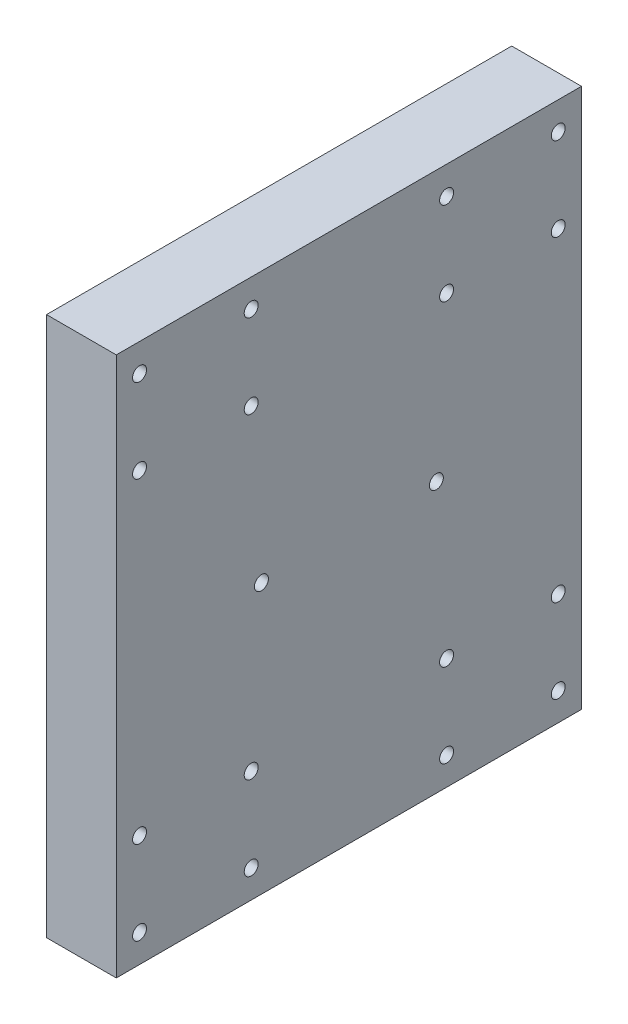
ISO-10303-21;
HEADER;
FILE_DESCRIPTION(('STEP AP214'),'2;1');
FILE_NAME('part.step','',(''),(''),'','','');
FILE_SCHEMA(('AUTOMOTIVE_DESIGN { 1 0 10303 214 1 1 1 1 }'));
ENDSEC;
DATA;
#1=APPLICATION_CONTEXT('core data for automotive mechanical design processes');
#2=APPLICATION_PROTOCOL_DEFINITION('international standard','automotive_design',2000,#1);
#3=PRODUCT_CONTEXT('',#1,'mechanical');
#4=PRODUCT('Part','Part','',(#3));
#5=PRODUCT_RELATED_PRODUCT_CATEGORY('part','',(#4));
#6=PRODUCT_DEFINITION_FORMATION('','',#4);
#7=PRODUCT_DEFINITION_CONTEXT('part definition',#1,'design');
#8=PRODUCT_DEFINITION('design','',#6,#7);
#9=PRODUCT_DEFINITION_SHAPE('','',#8);
#10=(LENGTH_UNIT() NAMED_UNIT(*) SI_UNIT(.MILLI.,.METRE.));
#11=(NAMED_UNIT(*) PLANE_ANGLE_UNIT() SI_UNIT($,.RADIAN.));
#12=(NAMED_UNIT(*) SI_UNIT($,.STERADIAN.) SOLID_ANGLE_UNIT());
#13=UNCERTAINTY_MEASURE_WITH_UNIT(LENGTH_MEASURE(1.E-05),#10,'distance_accuracy_value','');
#14=(GEOMETRIC_REPRESENTATION_CONTEXT(3) GLOBAL_UNCERTAINTY_ASSIGNED_CONTEXT((#13)) GLOBAL_UNIT_ASSIGNED_CONTEXT((#10,
#11,#12)) REPRESENTATION_CONTEXT('',''));
#15=CARTESIAN_POINT('',(0.,0.,0.));
#16=DIRECTION('',(0.,0.,1.));
#17=DIRECTION('',(1.,0.,0.));
#18=AXIS2_PLACEMENT_3D('',#15,#16,#17);
#19=CARTESIAN_POINT('',(15.,0.,0.));
#20=DIRECTION('',(-1.,0.,0.));
#21=DIRECTION('',(0.,0.,1.));
#22=AXIS2_PLACEMENT_3D('',#19,#20,#21);
#23=PLANE('',#22);
#24=CARTESIAN_POINT('',(15.,110.,-71.));
#25=DIRECTION('',(1.,0.,0.));
#26=DIRECTION('',(0.,0.,1.));
#27=AXIS2_PLACEMENT_3D('',#24,#25,#26);
#28=CIRCLE('',#27,1.5);
#29=CARTESIAN_POINT('',(15.,110.,-69.5));
#30=VERTEX_POINT('',#29);
#31=EDGE_CURVE('E205',#30,#30,#28,.T.);
#32=ORIENTED_EDGE('',*,*,#31,.F.);
#33=EDGE_LOOP('',(#32));
#34=FACE_BOUND('',#33,.T.);
#35=CARTESIAN_POINT('',(15.,92.,-95.));
#36=DIRECTION('',(1.,0.,0.));
#37=DIRECTION('',(0.,0.,1.));
#38=AXIS2_PLACEMENT_3D('',#35,#36,#37);
#39=CIRCLE('',#38,1.5);
#40=CARTESIAN_POINT('',(15.,92.,-93.5));
#41=VERTEX_POINT('',#40);
#42=EDGE_CURVE('E193',#41,#41,#39,.T.);
#43=ORIENTED_EDGE('',*,*,#42,.F.);
#44=EDGE_LOOP('',(#43));
#45=FACE_BOUND('',#44,.T.);
#46=CARTESIAN_POINT('',(15.,24.,-95.));
#47=DIRECTION('',(1.,0.,0.));
#48=DIRECTION('',(0.,0.,-1.));
#49=AXIS2_PLACEMENT_3D('',#46,#47,#48);
#50=CIRCLE('',#49,1.5);
#51=CARTESIAN_POINT('',(15.,24.,-96.5));
#52=VERTEX_POINT('',#51);
#53=EDGE_CURVE('E181',#52,#52,#50,.T.);
#54=ORIENTED_EDGE('',*,*,#53,.F.);
#55=EDGE_LOOP('',(#54));
#56=FACE_BOUND('',#55,.T.);
#57=CARTESIAN_POINT('',(15.,6.00000000000002,-71.));
#58=DIRECTION('',(1.,0.,0.));
#59=DIRECTION('',(0.,0.,-1.));
#60=AXIS2_PLACEMENT_3D('',#57,#58,#59);
#61=CIRCLE('',#60,1.5);
#62=CARTESIAN_POINT('',(15.,6.00000000000002,-72.5));
#63=VERTEX_POINT('',#62);
#64=EDGE_CURVE('E169',#63,#63,#61,.T.);
#65=ORIENTED_EDGE('',*,*,#64,.F.);
#66=EDGE_LOOP('',(#65));
#67=FACE_BOUND('',#66,.T.);
#68=CARTESIAN_POINT('',(15.,58.,-31.2));
#69=DIRECTION('',(1.,0.,0.));
#70=DIRECTION('',(0.,0.,-1.));
#71=AXIS2_PLACEMENT_3D('',#68,#69,#70);
#72=CIRCLE('',#71,1.5);
#73=CARTESIAN_POINT('',(15.,58.,-32.7));
#74=VERTEX_POINT('',#73);
#75=EDGE_CURVE('E157',#74,#74,#72,.T.);
#76=ORIENTED_EDGE('',*,*,#75,.F.);
#77=EDGE_LOOP('',(#76));
#78=FACE_BOUND('',#77,.T.);
#79=CARTESIAN_POINT('',(15.,6.00000000000001,-29.));
#80=DIRECTION('',(1.,0.,0.));
#81=DIRECTION('',(0.,0.,1.));
#82=AXIS2_PLACEMENT_3D('',#79,#80,#81);
#83=CIRCLE('',#82,1.5);
#84=CARTESIAN_POINT('',(15.,6.00000000000001,-27.5));
#85=VERTEX_POINT('',#84);
#86=EDGE_CURVE('E145',#85,#85,#83,.T.);
#87=ORIENTED_EDGE('',*,*,#86,.F.);
#88=EDGE_LOOP('',(#87));
#89=FACE_BOUND('',#88,.T.);
#90=CARTESIAN_POINT('',(15.,24.,-5.));
#91=DIRECTION('',(1.,0.,0.));
#92=DIRECTION('',(0.,0.,1.));
#93=AXIS2_PLACEMENT_3D('',#90,#91,#92);
#94=CIRCLE('',#93,1.5);
#95=CARTESIAN_POINT('',(15.,24.,-3.5));
#96=VERTEX_POINT('',#95);
#97=EDGE_CURVE('E133',#96,#96,#94,.T.);
#98=ORIENTED_EDGE('',*,*,#97,.F.);
#99=EDGE_LOOP('',(#98));
#100=FACE_BOUND('',#99,.T.);
#101=CARTESIAN_POINT('',(15.,92.,-5.));
#102=DIRECTION('',(1.,0.,0.));
#103=DIRECTION('',(0.,0.,-1.));
#104=AXIS2_PLACEMENT_3D('',#101,#102,#103);
#105=CIRCLE('',#104,1.5);
#106=CARTESIAN_POINT('',(15.,92.,-6.5));
#107=VERTEX_POINT('',#106);
#108=EDGE_CURVE('E121',#107,#107,#105,.T.);
#109=ORIENTED_EDGE('',*,*,#108,.F.);
#110=EDGE_LOOP('',(#109));
#111=FACE_BOUND('',#110,.T.);
#112=CARTESIAN_POINT('',(15.,110.,-5.));
#113=DIRECTION('',(1.,0.,0.));
#114=DIRECTION('',(0.,0.,-1.));
#115=AXIS2_PLACEMENT_3D('',#112,#113,#114);
#116=CIRCLE('',#115,1.5);
#117=CARTESIAN_POINT('',(15.,110.,-6.5));
#118=VERTEX_POINT('',#117);
#119=EDGE_CURVE('E100',#118,#118,#116,.T.);
#120=ORIENTED_EDGE('',*,*,#119,.F.);
#121=EDGE_LOOP('',(#120));
#122=FACE_BOUND('',#121,.T.);
#123=DIRECTION('',(0.,-1.,0.));
#124=VECTOR('',#123,1.);
#125=CARTESIAN_POINT('',(15.,0.,0.));
#126=LINE('',#125,#124);
#127=CARTESIAN_POINT('',(15.,116.,0.));
#128=VERTEX_POINT('',#127);
#129=CARTESIAN_POINT('',(15.,0.,0.));
#130=VERTEX_POINT('',#129);
#131=EDGE_CURVE('E85',#128,#130,#126,.T.);
#132=ORIENTED_EDGE('',*,*,#131,.T.);
#133=DIRECTION('',(0.,0.,-1.));
#134=VECTOR('',#133,1.);
#135=CARTESIAN_POINT('',(15.,0.,0.));
#136=LINE('',#135,#134);
#137=CARTESIAN_POINT('',(15.,0.,-100.));
#138=VERTEX_POINT('',#137);
#139=EDGE_CURVE('E80',#130,#138,#136,.T.);
#140=ORIENTED_EDGE('',*,*,#139,.T.);
#141=DIRECTION('',(0.,1.,0.));
#142=VECTOR('',#141,1.);
#143=CARTESIAN_POINT('',(15.,0.,-100.));
#144=LINE('',#143,#142);
#145=CARTESIAN_POINT('',(15.,116.,-100.));
#146=VERTEX_POINT('',#145);
#147=EDGE_CURVE('E83',#138,#146,#144,.T.);
#148=ORIENTED_EDGE('',*,*,#147,.T.);
#149=DIRECTION('',(0.,0.,1.));
#150=VECTOR('',#149,1.);
#151=CARTESIAN_POINT('',(15.,116.,0.));
#152=LINE('',#151,#150);
#153=EDGE_CURVE('E50',#146,#128,#152,.T.);
#154=ORIENTED_EDGE('',*,*,#153,.T.);
#155=EDGE_LOOP('',(#132,#140,#148,#154));
#156=FACE_BOUND('',#155,.T.);
#157=CARTESIAN_POINT('',(15.,110.,-29.));
#158=DIRECTION('',(1.,0.,0.));
#159=DIRECTION('',(0.,0.,-1.));
#160=AXIS2_PLACEMENT_3D('',#157,#158,#159);
#161=CIRCLE('',#160,1.5);
#162=CARTESIAN_POINT('',(15.,110.,-30.5));
#163=VERTEX_POINT('',#162);
#164=EDGE_CURVE('E115',#163,#163,#161,.T.);
#165=ORIENTED_EDGE('',*,*,#164,.F.);
#166=EDGE_LOOP('',(#165));
#167=FACE_BOUND('',#166,.T.);
#168=CARTESIAN_POINT('',(15.,92.,-29.));
#169=DIRECTION('',(1.,0.,0.));
#170=DIRECTION('',(0.,0.,-1.));
#171=AXIS2_PLACEMENT_3D('',#168,#169,#170);
#172=CIRCLE('',#171,1.5);
#173=CARTESIAN_POINT('',(15.,92.,-30.5));
#174=VERTEX_POINT('',#173);
#175=EDGE_CURVE('E127',#174,#174,#172,.T.);
#176=ORIENTED_EDGE('',*,*,#175,.F.);
#177=EDGE_LOOP('',(#176));
#178=FACE_BOUND('',#177,.T.);
#179=CARTESIAN_POINT('',(15.,24.,-29.));
#180=DIRECTION('',(1.,0.,0.));
#181=DIRECTION('',(0.,0.,1.));
#182=AXIS2_PLACEMENT_3D('',#179,#180,#181);
#183=CIRCLE('',#182,1.5);
#184=CARTESIAN_POINT('',(15.,24.,-27.5));
#185=VERTEX_POINT('',#184);
#186=EDGE_CURVE('E139',#185,#185,#183,.T.);
#187=ORIENTED_EDGE('',*,*,#186,.F.);
#188=EDGE_LOOP('',(#187));
#189=FACE_BOUND('',#188,.T.);
#190=CARTESIAN_POINT('',(15.,6.00000000000001,-5.));
#191=DIRECTION('',(1.,0.,0.));
#192=DIRECTION('',(0.,0.,1.));
#193=AXIS2_PLACEMENT_3D('',#190,#191,#192);
#194=CIRCLE('',#193,1.5);
#195=CARTESIAN_POINT('',(15.,6.00000000000001,-3.5));
#196=VERTEX_POINT('',#195);
#197=EDGE_CURVE('E151',#196,#196,#194,.T.);
#198=ORIENTED_EDGE('',*,*,#197,.F.);
#199=EDGE_LOOP('',(#198));
#200=FACE_BOUND('',#199,.T.);
#201=CARTESIAN_POINT('',(15.,58.,-68.8));
#202=DIRECTION('',(1.,0.,0.));
#203=DIRECTION('',(0.,0.,-1.));
#204=AXIS2_PLACEMENT_3D('',#201,#202,#203);
#205=CIRCLE('',#204,1.5);
#206=CARTESIAN_POINT('',(15.,58.,-70.3));
#207=VERTEX_POINT('',#206);
#208=EDGE_CURVE('E163',#207,#207,#205,.T.);
#209=ORIENTED_EDGE('',*,*,#208,.F.);
#210=EDGE_LOOP('',(#209));
#211=FACE_BOUND('',#210,.T.);
#212=CARTESIAN_POINT('',(15.,6.00000000000001,-95.));
#213=DIRECTION('',(1.,0.,0.));
#214=DIRECTION('',(0.,0.,-1.));
#215=AXIS2_PLACEMENT_3D('',#212,#213,#214);
#216=CIRCLE('',#215,1.5);
#217=CARTESIAN_POINT('',(15.,6.00000000000001,-96.5));
#218=VERTEX_POINT('',#217);
#219=EDGE_CURVE('E175',#218,#218,#216,.T.);
#220=ORIENTED_EDGE('',*,*,#219,.F.);
#221=EDGE_LOOP('',(#220));
#222=FACE_BOUND('',#221,.T.);
#223=CARTESIAN_POINT('',(15.,24.,-71.));
#224=DIRECTION('',(1.,0.,0.));
#225=DIRECTION('',(0.,0.,-1.));
#226=AXIS2_PLACEMENT_3D('',#223,#224,#225);
#227=CIRCLE('',#226,1.5);
#228=CARTESIAN_POINT('',(15.,24.,-72.5));
#229=VERTEX_POINT('',#228);
#230=EDGE_CURVE('E187',#229,#229,#227,.T.);
#231=ORIENTED_EDGE('',*,*,#230,.F.);
#232=EDGE_LOOP('',(#231));
#233=FACE_BOUND('',#232,.T.);
#234=CARTESIAN_POINT('',(15.,92.,-71.));
#235=DIRECTION('',(1.,0.,0.));
#236=DIRECTION('',(0.,0.,1.));
#237=AXIS2_PLACEMENT_3D('',#234,#235,#236);
#238=CIRCLE('',#237,1.5);
#239=CARTESIAN_POINT('',(15.,92.,-69.5));
#240=VERTEX_POINT('',#239);
#241=EDGE_CURVE('E199',#240,#240,#238,.T.);
#242=ORIENTED_EDGE('',*,*,#241,.F.);
#243=EDGE_LOOP('',(#242));
#244=FACE_BOUND('',#243,.T.);
#245=CARTESIAN_POINT('',(15.,110.,-95.));
#246=DIRECTION('',(1.,0.,0.));
#247=DIRECTION('',(0.,0.,1.));
#248=AXIS2_PLACEMENT_3D('',#245,#246,#247);
#249=CIRCLE('',#248,1.5);
#250=CARTESIAN_POINT('',(15.,110.,-93.5));
#251=VERTEX_POINT('',#250);
#252=EDGE_CURVE('E211',#251,#251,#249,.T.);
#253=ORIENTED_EDGE('',*,*,#252,.F.);
#254=EDGE_LOOP('',(#253));
#255=FACE_BOUND('',#254,.T.);
#256=ADVANCED_FACE('F33',(#34,#45,#56,#67,#78,#89,#100,#111,#122,#156,#167,#178,#189,#200,#211,
#222,#233,#244,#255),#23,.F.);
#257=CARTESIAN_POINT('',(0.,0.,0.));
#258=DIRECTION('',(-1.,0.,0.));
#259=DIRECTION('',(0.,0.,1.));
#260=AXIS2_PLACEMENT_3D('',#257,#258,#259);
#261=PLANE('',#260);
#262=CARTESIAN_POINT('',(0.,58.,-54.5));
#263=DIRECTION('',(-1.,0.,0.));
#264=DIRECTION('',(0.,0.,1.));
#265=AXIS2_PLACEMENT_3D('',#262,#263,#264);
#266=CIRCLE('',#265,11.);
#267=CARTESIAN_POINT('',(0.,58.,-43.5));
#268=VERTEX_POINT('',#267);
#269=EDGE_CURVE('E232',#268,#268,#266,.T.);
#270=ORIENTED_EDGE('',*,*,#269,.F.);
#271=EDGE_LOOP('',(#270));
#272=FACE_BOUND('',#271,.T.);
#273=CARTESIAN_POINT('',(0.,17.,-53.5));
#274=DIRECTION('',(-1.,0.,0.));
#275=DIRECTION('',(0.,0.,1.));
#276=AXIS2_PLACEMENT_3D('',#273,#274,#275);
#277=CIRCLE('',#276,5.);
#278=CARTESIAN_POINT('',(0.,17.,-48.5));
#279=VERTEX_POINT('',#278);
#280=EDGE_CURVE('E226',#279,#279,#277,.T.);
#281=ORIENTED_EDGE('',*,*,#280,.F.);
#282=EDGE_LOOP('',(#281));
#283=FACE_BOUND('',#282,.T.);
#284=CARTESIAN_POINT('',(0.,99.,-53.5));
#285=DIRECTION('',(-1.,0.,0.));
#286=DIRECTION('',(0.,0.,1.));
#287=AXIS2_PLACEMENT_3D('',#284,#285,#286);
#288=CIRCLE('',#287,5.);
#289=CARTESIAN_POINT('',(0.,99.,-48.5));
#290=VERTEX_POINT('',#289);
#291=EDGE_CURVE('E220',#290,#290,#288,.T.);
#292=ORIENTED_EDGE('',*,*,#291,.F.);
#293=EDGE_LOOP('',(#292));
#294=FACE_BOUND('',#293,.T.);
#295=CARTESIAN_POINT('',(0.,110.,-71.));
#296=DIRECTION('',(1.,0.,0.));
#297=DIRECTION('',(0.,0.,1.));
#298=AXIS2_PLACEMENT_3D('',#295,#296,#297);
#299=CIRCLE('',#298,1.5);
#300=CARTESIAN_POINT('',(0.,110.,-69.5));
#301=VERTEX_POINT('',#300);
#302=EDGE_CURVE('E208',#301,#301,#299,.T.);
#303=ORIENTED_EDGE('',*,*,#302,.T.);
#304=EDGE_LOOP('',(#303));
#305=FACE_BOUND('',#304,.T.);
#306=CARTESIAN_POINT('',(0.,92.,-95.));
#307=DIRECTION('',(1.,0.,0.));
#308=DIRECTION('',(0.,0.,1.));
#309=AXIS2_PLACEMENT_3D('',#306,#307,#308);
#310=CIRCLE('',#309,1.5);
#311=CARTESIAN_POINT('',(0.,92.,-93.5));
#312=VERTEX_POINT('',#311);
#313=EDGE_CURVE('E196',#312,#312,#310,.T.);
#314=ORIENTED_EDGE('',*,*,#313,.T.);
#315=EDGE_LOOP('',(#314));
#316=FACE_BOUND('',#315,.T.);
#317=CARTESIAN_POINT('',(0.,24.,-95.));
#318=DIRECTION('',(1.,0.,0.));
#319=DIRECTION('',(0.,0.,-1.));
#320=AXIS2_PLACEMENT_3D('',#317,#318,#319);
#321=CIRCLE('',#320,1.5);
#322=CARTESIAN_POINT('',(0.,24.,-96.5));
#323=VERTEX_POINT('',#322);
#324=EDGE_CURVE('E184',#323,#323,#321,.T.);
#325=ORIENTED_EDGE('',*,*,#324,.T.);
#326=EDGE_LOOP('',(#325));
#327=FACE_BOUND('',#326,.T.);
#328=CARTESIAN_POINT('',(0.,6.00000000000002,-71.));
#329=DIRECTION('',(1.,0.,0.));
#330=DIRECTION('',(0.,0.,-1.));
#331=AXIS2_PLACEMENT_3D('',#328,#329,#330);
#332=CIRCLE('',#331,1.5);
#333=CARTESIAN_POINT('',(0.,6.00000000000002,-72.5));
#334=VERTEX_POINT('',#333);
#335=EDGE_CURVE('E172',#334,#334,#332,.T.);
#336=ORIENTED_EDGE('',*,*,#335,.T.);
#337=EDGE_LOOP('',(#336));
#338=FACE_BOUND('',#337,.T.);
#339=CARTESIAN_POINT('',(0.,58.,-31.2));
#340=DIRECTION('',(1.,0.,0.));
#341=DIRECTION('',(0.,0.,-1.));
#342=AXIS2_PLACEMENT_3D('',#339,#340,#341);
#343=CIRCLE('',#342,1.5);
#344=CARTESIAN_POINT('',(0.,58.,-32.7));
#345=VERTEX_POINT('',#344);
#346=EDGE_CURVE('E160',#345,#345,#343,.T.);
#347=ORIENTED_EDGE('',*,*,#346,.T.);
#348=EDGE_LOOP('',(#347));
#349=FACE_BOUND('',#348,.T.);
#350=CARTESIAN_POINT('',(0.,6.00000000000001,-29.));
#351=DIRECTION('',(1.,0.,0.));
#352=DIRECTION('',(0.,0.,1.));
#353=AXIS2_PLACEMENT_3D('',#350,#351,#352);
#354=CIRCLE('',#353,1.5);
#355=CARTESIAN_POINT('',(0.,6.00000000000001,-27.5));
#356=VERTEX_POINT('',#355);
#357=EDGE_CURVE('E148',#356,#356,#354,.T.);
#358=ORIENTED_EDGE('',*,*,#357,.T.);
#359=EDGE_LOOP('',(#358));
#360=FACE_BOUND('',#359,.T.);
#361=CARTESIAN_POINT('',(0.,24.,-5.));
#362=DIRECTION('',(1.,0.,0.));
#363=DIRECTION('',(0.,0.,1.));
#364=AXIS2_PLACEMENT_3D('',#361,#362,#363);
#365=CIRCLE('',#364,1.5);
#366=CARTESIAN_POINT('',(0.,24.,-3.5));
#367=VERTEX_POINT('',#366);
#368=EDGE_CURVE('E136',#367,#367,#365,.T.);
#369=ORIENTED_EDGE('',*,*,#368,.T.);
#370=EDGE_LOOP('',(#369));
#371=FACE_BOUND('',#370,.T.);
#372=CARTESIAN_POINT('',(0.,92.,-5.));
#373=DIRECTION('',(1.,0.,0.));
#374=DIRECTION('',(0.,0.,-1.));
#375=AXIS2_PLACEMENT_3D('',#372,#373,#374);
#376=CIRCLE('',#375,1.5);
#377=CARTESIAN_POINT('',(0.,92.,-6.5));
#378=VERTEX_POINT('',#377);
#379=EDGE_CURVE('E124',#378,#378,#376,.T.);
#380=ORIENTED_EDGE('',*,*,#379,.T.);
#381=EDGE_LOOP('',(#380));
#382=FACE_BOUND('',#381,.T.);
#383=CARTESIAN_POINT('',(0.,110.,-5.));
#384=DIRECTION('',(1.,0.,0.));
#385=DIRECTION('',(0.,0.,-1.));
#386=AXIS2_PLACEMENT_3D('',#383,#384,#385);
#387=CIRCLE('',#386,1.5);
#388=CARTESIAN_POINT('',(0.,110.,-6.5));
#389=VERTEX_POINT('',#388);
#390=EDGE_CURVE('E112',#389,#389,#387,.T.);
#391=ORIENTED_EDGE('',*,*,#390,.T.);
#392=EDGE_LOOP('',(#391));
#393=FACE_BOUND('',#392,.T.);
#394=DIRECTION('',(0.,-1.,0.));
#395=VECTOR('',#394,1.);
#396=CARTESIAN_POINT('',(0.,0.,0.));
#397=LINE('',#396,#395);
#398=CARTESIAN_POINT('',(0.,116.,0.));
#399=VERTEX_POINT('',#398);
#400=CARTESIAN_POINT('',(0.,0.,0.));
#401=VERTEX_POINT('',#400);
#402=EDGE_CURVE('E97',#399,#401,#397,.T.);
#403=ORIENTED_EDGE('',*,*,#402,.F.);
#404=DIRECTION('',(0.,0.,1.));
#405=VECTOR('',#404,1.);
#406=CARTESIAN_POINT('',(0.,116.,0.));
#407=LINE('',#406,#405);
#408=CARTESIAN_POINT('',(0.,116.,-100.));
#409=VERTEX_POINT('',#408);
#410=EDGE_CURVE('E73',#409,#399,#407,.T.);
#411=ORIENTED_EDGE('',*,*,#410,.F.);
#412=DIRECTION('',(0.,1.,0.));
#413=VECTOR('',#412,1.);
#414=CARTESIAN_POINT('',(0.,0.,-100.));
#415=LINE('',#414,#413);
#416=CARTESIAN_POINT('',(0.,0.,-100.));
#417=VERTEX_POINT('',#416);
#418=EDGE_CURVE('E67',#417,#409,#415,.T.);
#419=ORIENTED_EDGE('',*,*,#418,.F.);
#420=DIRECTION('',(0.,0.,-1.));
#421=VECTOR('',#420,1.);
#422=CARTESIAN_POINT('',(0.,0.,0.));
#423=LINE('',#422,#421);
#424=EDGE_CURVE('E89',#401,#417,#423,.T.);
#425=ORIENTED_EDGE('',*,*,#424,.F.);
#426=EDGE_LOOP('',(#403,#411,#419,#425));
#427=FACE_BOUND('',#426,.T.);
#428=CARTESIAN_POINT('',(0.,110.,-29.));
#429=DIRECTION('',(1.,0.,0.));
#430=DIRECTION('',(0.,0.,-1.));
#431=AXIS2_PLACEMENT_3D('',#428,#429,#430);
#432=CIRCLE('',#431,1.5);
#433=CARTESIAN_POINT('',(0.,110.,-30.5));
#434=VERTEX_POINT('',#433);
#435=EDGE_CURVE('E118',#434,#434,#432,.T.);
#436=ORIENTED_EDGE('',*,*,#435,.T.);
#437=EDGE_LOOP('',(#436));
#438=FACE_BOUND('',#437,.T.);
#439=CARTESIAN_POINT('',(0.,92.,-29.));
#440=DIRECTION('',(1.,0.,0.));
#441=DIRECTION('',(0.,0.,-1.));
#442=AXIS2_PLACEMENT_3D('',#439,#440,#441);
#443=CIRCLE('',#442,1.5);
#444=CARTESIAN_POINT('',(0.,92.,-30.5));
#445=VERTEX_POINT('',#444);
#446=EDGE_CURVE('E130',#445,#445,#443,.T.);
#447=ORIENTED_EDGE('',*,*,#446,.T.);
#448=EDGE_LOOP('',(#447));
#449=FACE_BOUND('',#448,.T.);
#450=CARTESIAN_POINT('',(0.,24.,-29.));
#451=DIRECTION('',(1.,0.,0.));
#452=DIRECTION('',(0.,0.,1.));
#453=AXIS2_PLACEMENT_3D('',#450,#451,#452);
#454=CIRCLE('',#453,1.5);
#455=CARTESIAN_POINT('',(0.,24.,-27.5));
#456=VERTEX_POINT('',#455);
#457=EDGE_CURVE('E142',#456,#456,#454,.T.);
#458=ORIENTED_EDGE('',*,*,#457,.T.);
#459=EDGE_LOOP('',(#458));
#460=FACE_BOUND('',#459,.T.);
#461=CARTESIAN_POINT('',(0.,6.00000000000001,-5.));
#462=DIRECTION('',(1.,0.,0.));
#463=DIRECTION('',(0.,0.,1.));
#464=AXIS2_PLACEMENT_3D('',#461,#462,#463);
#465=CIRCLE('',#464,1.5);
#466=CARTESIAN_POINT('',(0.,6.00000000000001,-3.5));
#467=VERTEX_POINT('',#466);
#468=EDGE_CURVE('E154',#467,#467,#465,.T.);
#469=ORIENTED_EDGE('',*,*,#468,.T.);
#470=EDGE_LOOP('',(#469));
#471=FACE_BOUND('',#470,.T.);
#472=CARTESIAN_POINT('',(0.,58.,-68.8));
#473=DIRECTION('',(1.,0.,0.));
#474=DIRECTION('',(0.,0.,-1.));
#475=AXIS2_PLACEMENT_3D('',#472,#473,#474);
#476=CIRCLE('',#475,1.5);
#477=CARTESIAN_POINT('',(0.,58.,-70.3));
#478=VERTEX_POINT('',#477);
#479=EDGE_CURVE('E166',#478,#478,#476,.T.);
#480=ORIENTED_EDGE('',*,*,#479,.T.);
#481=EDGE_LOOP('',(#480));
#482=FACE_BOUND('',#481,.T.);
#483=CARTESIAN_POINT('',(0.,6.00000000000001,-95.));
#484=DIRECTION('',(1.,0.,0.));
#485=DIRECTION('',(0.,0.,-1.));
#486=AXIS2_PLACEMENT_3D('',#483,#484,#485);
#487=CIRCLE('',#486,1.5);
#488=CARTESIAN_POINT('',(0.,6.00000000000001,-96.5));
#489=VERTEX_POINT('',#488);
#490=EDGE_CURVE('E178',#489,#489,#487,.T.);
#491=ORIENTED_EDGE('',*,*,#490,.T.);
#492=EDGE_LOOP('',(#491));
#493=FACE_BOUND('',#492,.T.);
#494=CARTESIAN_POINT('',(0.,24.,-71.));
#495=DIRECTION('',(1.,0.,0.));
#496=DIRECTION('',(0.,0.,-1.));
#497=AXIS2_PLACEMENT_3D('',#494,#495,#496);
#498=CIRCLE('',#497,1.5);
#499=CARTESIAN_POINT('',(0.,24.,-72.5));
#500=VERTEX_POINT('',#499);
#501=EDGE_CURVE('E190',#500,#500,#498,.T.);
#502=ORIENTED_EDGE('',*,*,#501,.T.);
#503=EDGE_LOOP('',(#502));
#504=FACE_BOUND('',#503,.T.);
#505=CARTESIAN_POINT('',(0.,92.,-71.));
#506=DIRECTION('',(1.,0.,0.));
#507=DIRECTION('',(0.,0.,1.));
#508=AXIS2_PLACEMENT_3D('',#505,#506,#507);
#509=CIRCLE('',#508,1.5);
#510=CARTESIAN_POINT('',(0.,92.,-69.5));
#511=VERTEX_POINT('',#510);
#512=EDGE_CURVE('E202',#511,#511,#509,.T.);
#513=ORIENTED_EDGE('',*,*,#512,.T.);
#514=EDGE_LOOP('',(#513));
#515=FACE_BOUND('',#514,.T.);
#516=CARTESIAN_POINT('',(0.,110.,-95.));
#517=DIRECTION('',(1.,0.,0.));
#518=DIRECTION('',(0.,0.,1.));
#519=AXIS2_PLACEMENT_3D('',#516,#517,#518);
#520=CIRCLE('',#519,1.5);
#521=CARTESIAN_POINT('',(0.,110.,-93.5));
#522=VERTEX_POINT('',#521);
#523=EDGE_CURVE('E214',#522,#522,#520,.T.);
#524=ORIENTED_EDGE('',*,*,#523,.T.);
#525=EDGE_LOOP('',(#524));
#526=FACE_BOUND('',#525,.T.);
#527=ADVANCED_FACE('F108',(#272,#283,#294,#305,#316,#327,#338,#349,#360,#371,#382,#393,#427,
#438,#449,#460,#471,#482,#493,#504,#515,#526),#261,.T.);
#528=CARTESIAN_POINT('',(15.,0.,0.));
#529=DIRECTION('',(0.,0.,-1.));
#530=DIRECTION('',(-1.,0.,0.));
#531=AXIS2_PLACEMENT_3D('',#528,#529,#530);
#532=PLANE('',#531);
#533=ORIENTED_EDGE('',*,*,#402,.T.);
#534=DIRECTION('',(-1.,0.,0.));
#535=VECTOR('',#534,1.);
#536=CARTESIAN_POINT('',(15.,0.,0.));
#537=LINE('',#536,#535);
#538=EDGE_CURVE('E11',#130,#401,#537,.T.);
#539=ORIENTED_EDGE('',*,*,#538,.F.);
#540=ORIENTED_EDGE('',*,*,#131,.F.);
#541=DIRECTION('',(-1.,0.,0.));
#542=VECTOR('',#541,1.);
#543=CARTESIAN_POINT('',(15.,116.,0.));
#544=LINE('',#543,#542);
#545=EDGE_CURVE('E93',#128,#399,#544,.T.);
#546=ORIENTED_EDGE('',*,*,#545,.T.);
#547=EDGE_LOOP('',(#533,#539,#540,#546));
#548=FACE_BOUND('',#547,.T.);
#549=ADVANCED_FACE('F35',(#548),#532,.F.);
#550=CARTESIAN_POINT('',(15.,0.,0.));
#551=DIRECTION('',(0.,1.,0.));
#552=DIRECTION('',(0.,0.,1.));
#553=AXIS2_PLACEMENT_3D('',#550,#551,#552);
#554=PLANE('',#553);
#555=ORIENTED_EDGE('',*,*,#424,.T.);
#556=DIRECTION('',(-1.,0.,0.));
#557=VECTOR('',#556,1.);
#558=CARTESIAN_POINT('',(15.,0.,-100.));
#559=LINE('',#558,#557);
#560=EDGE_CURVE('E42',#138,#417,#559,.T.);
#561=ORIENTED_EDGE('',*,*,#560,.F.);
#562=ORIENTED_EDGE('',*,*,#139,.F.);
#563=ORIENTED_EDGE('',*,*,#538,.T.);
#564=EDGE_LOOP('',(#555,#561,#562,#563));
#565=FACE_BOUND('',#564,.T.);
#566=ADVANCED_FACE('F88',(#565),#554,.F.);
#567=CARTESIAN_POINT('',(15.,0.,-100.));
#568=DIRECTION('',(0.,0.,1.));
#569=DIRECTION('',(1.,0.,0.));
#570=AXIS2_PLACEMENT_3D('',#567,#568,#569);
#571=PLANE('',#570);
#572=ORIENTED_EDGE('',*,*,#418,.T.);
#573=DIRECTION('',(-1.,0.,0.));
#574=VECTOR('',#573,1.);
#575=CARTESIAN_POINT('',(15.,116.,-100.));
#576=LINE('',#575,#574);
#577=EDGE_CURVE('E90',#146,#409,#576,.T.);
#578=ORIENTED_EDGE('',*,*,#577,.F.);
#579=ORIENTED_EDGE('',*,*,#147,.F.);
#580=ORIENTED_EDGE('',*,*,#560,.T.);
#581=EDGE_LOOP('',(#572,#578,#579,#580));
#582=FACE_BOUND('',#581,.T.);
#583=ADVANCED_FACE('F91',(#582),#571,.F.);
#584=CARTESIAN_POINT('',(15.,116.,0.));
#585=DIRECTION('',(0.,-1.,0.));
#586=DIRECTION('',(0.,0.,-1.));
#587=AXIS2_PLACEMENT_3D('',#584,#585,#586);
#588=PLANE('',#587);
#589=ORIENTED_EDGE('',*,*,#410,.T.);
#590=ORIENTED_EDGE('',*,*,#545,.F.);
#591=ORIENTED_EDGE('',*,*,#153,.F.);
#592=ORIENTED_EDGE('',*,*,#577,.T.);
#593=EDGE_LOOP('',(#589,#590,#591,#592));
#594=FACE_BOUND('',#593,.T.);
#595=ADVANCED_FACE('F105',(#594),#588,.F.);
#596=CARTESIAN_POINT('',(15.,110.,-5.));
#597=DIRECTION('',(-1.,0.,0.));
#598=DIRECTION('',(0.,0.,1.));
#599=AXIS2_PLACEMENT_3D('',#596,#597,#598);
#600=CYLINDRICAL_SURFACE('',#599,1.5);
#601=ORIENTED_EDGE('',*,*,#119,.T.);
#602=EDGE_LOOP('',(#601));
#603=FACE_BOUND('',#602,.T.);
#604=ORIENTED_EDGE('',*,*,#390,.F.);
#605=EDGE_LOOP('',(#604));
#606=FACE_BOUND('',#605,.T.);
#607=ADVANCED_FACE('F272',(#603,#606),#600,.F.);
#608=CARTESIAN_POINT('',(15.,110.,-29.));
#609=DIRECTION('',(-1.,0.,0.));
#610=DIRECTION('',(0.,0.,1.));
#611=AXIS2_PLACEMENT_3D('',#608,#609,#610);
#612=CYLINDRICAL_SURFACE('',#611,1.5);
#613=ORIENTED_EDGE('',*,*,#164,.T.);
#614=EDGE_LOOP('',(#613));
#615=FACE_BOUND('',#614,.T.);
#616=ORIENTED_EDGE('',*,*,#435,.F.);
#617=EDGE_LOOP('',(#616));
#618=FACE_BOUND('',#617,.T.);
#619=ADVANCED_FACE('F274',(#615,#618),#612,.F.);
#620=CARTESIAN_POINT('',(15.,92.,-5.));
#621=DIRECTION('',(-1.,0.,0.));
#622=DIRECTION('',(0.,0.,1.));
#623=AXIS2_PLACEMENT_3D('',#620,#621,#622);
#624=CYLINDRICAL_SURFACE('',#623,1.5);
#625=ORIENTED_EDGE('',*,*,#108,.T.);
#626=EDGE_LOOP('',(#625));
#627=FACE_BOUND('',#626,.T.);
#628=ORIENTED_EDGE('',*,*,#379,.F.);
#629=EDGE_LOOP('',(#628));
#630=FACE_BOUND('',#629,.T.);
#631=ADVANCED_FACE('F281',(#627,#630),#624,.F.);
#632=CARTESIAN_POINT('',(15.,92.,-29.));
#633=DIRECTION('',(-1.,0.,0.));
#634=DIRECTION('',(0.,0.,1.));
#635=AXIS2_PLACEMENT_3D('',#632,#633,#634);
#636=CYLINDRICAL_SURFACE('',#635,1.5);
#637=ORIENTED_EDGE('',*,*,#175,.T.);
#638=EDGE_LOOP('',(#637));
#639=FACE_BOUND('',#638,.T.);
#640=ORIENTED_EDGE('',*,*,#446,.F.);
#641=EDGE_LOOP('',(#640));
#642=FACE_BOUND('',#641,.T.);
#643=ADVANCED_FACE('F422',(#639,#642),#636,.F.);
#644=CARTESIAN_POINT('',(15.,24.,-5.));
#645=DIRECTION('',(-1.,0.,0.));
#646=DIRECTION('',(0.,0.,1.));
#647=AXIS2_PLACEMENT_3D('',#644,#645,#646);
#648=CYLINDRICAL_SURFACE('',#647,1.5);
#649=ORIENTED_EDGE('',*,*,#97,.T.);
#650=EDGE_LOOP('',(#649));
#651=FACE_BOUND('',#650,.T.);
#652=ORIENTED_EDGE('',*,*,#368,.F.);
#653=EDGE_LOOP('',(#652));
#654=FACE_BOUND('',#653,.T.);
#655=ADVANCED_FACE('F418',(#651,#654),#648,.F.);
#656=CARTESIAN_POINT('',(15.,24.,-29.));
#657=DIRECTION('',(-1.,0.,0.));
#658=DIRECTION('',(0.,0.,1.));
#659=AXIS2_PLACEMENT_3D('',#656,#657,#658);
#660=CYLINDRICAL_SURFACE('',#659,1.5);
#661=ORIENTED_EDGE('',*,*,#186,.T.);
#662=EDGE_LOOP('',(#661));
#663=FACE_BOUND('',#662,.T.);
#664=ORIENTED_EDGE('',*,*,#457,.F.);
#665=EDGE_LOOP('',(#664));
#666=FACE_BOUND('',#665,.T.);
#667=ADVANCED_FACE('F414',(#663,#666),#660,.F.);
#668=CARTESIAN_POINT('',(15.,6.00000000000001,-29.));
#669=DIRECTION('',(-1.,0.,0.));
#670=DIRECTION('',(0.,0.,1.));
#671=AXIS2_PLACEMENT_3D('',#668,#669,#670);
#672=CYLINDRICAL_SURFACE('',#671,1.5);
#673=ORIENTED_EDGE('',*,*,#86,.T.);
#674=EDGE_LOOP('',(#673));
#675=FACE_BOUND('',#674,.T.);
#676=ORIENTED_EDGE('',*,*,#357,.F.);
#677=EDGE_LOOP('',(#676));
#678=FACE_BOUND('',#677,.T.);
#679=ADVANCED_FACE('F410',(#675,#678),#672,.F.);
#680=CARTESIAN_POINT('',(15.,6.00000000000001,-5.));
#681=DIRECTION('',(-1.,0.,0.));
#682=DIRECTION('',(0.,0.,1.));
#683=AXIS2_PLACEMENT_3D('',#680,#681,#682);
#684=CYLINDRICAL_SURFACE('',#683,1.5);
#685=ORIENTED_EDGE('',*,*,#197,.T.);
#686=EDGE_LOOP('',(#685));
#687=FACE_BOUND('',#686,.T.);
#688=ORIENTED_EDGE('',*,*,#468,.F.);
#689=EDGE_LOOP('',(#688));
#690=FACE_BOUND('',#689,.T.);
#691=ADVANCED_FACE('F406',(#687,#690),#684,.F.);
#692=CARTESIAN_POINT('',(15.,58.,-31.2));
#693=DIRECTION('',(-1.,0.,0.));
#694=DIRECTION('',(0.,0.,1.));
#695=AXIS2_PLACEMENT_3D('',#692,#693,#694);
#696=CYLINDRICAL_SURFACE('',#695,1.5);
#697=ORIENTED_EDGE('',*,*,#75,.T.);
#698=EDGE_LOOP('',(#697));
#699=FACE_BOUND('',#698,.T.);
#700=ORIENTED_EDGE('',*,*,#346,.F.);
#701=EDGE_LOOP('',(#700));
#702=FACE_BOUND('',#701,.T.);
#703=ADVANCED_FACE('F402',(#699,#702),#696,.F.);
#704=CARTESIAN_POINT('',(15.,58.,-68.8));
#705=DIRECTION('',(-1.,0.,0.));
#706=DIRECTION('',(0.,0.,1.));
#707=AXIS2_PLACEMENT_3D('',#704,#705,#706);
#708=CYLINDRICAL_SURFACE('',#707,1.5);
#709=ORIENTED_EDGE('',*,*,#208,.T.);
#710=EDGE_LOOP('',(#709));
#711=FACE_BOUND('',#710,.T.);
#712=ORIENTED_EDGE('',*,*,#479,.F.);
#713=EDGE_LOOP('',(#712));
#714=FACE_BOUND('',#713,.T.);
#715=ADVANCED_FACE('F398',(#711,#714),#708,.F.);
#716=CARTESIAN_POINT('',(15.,6.00000000000002,-71.));
#717=DIRECTION('',(-1.,0.,0.));
#718=DIRECTION('',(0.,0.,1.));
#719=AXIS2_PLACEMENT_3D('',#716,#717,#718);
#720=CYLINDRICAL_SURFACE('',#719,1.5);
#721=ORIENTED_EDGE('',*,*,#64,.T.);
#722=EDGE_LOOP('',(#721));
#723=FACE_BOUND('',#722,.T.);
#724=ORIENTED_EDGE('',*,*,#335,.F.);
#725=EDGE_LOOP('',(#724));
#726=FACE_BOUND('',#725,.T.);
#727=ADVANCED_FACE('F394',(#723,#726),#720,.F.);
#728=CARTESIAN_POINT('',(15.,6.00000000000001,-95.));
#729=DIRECTION('',(-1.,0.,0.));
#730=DIRECTION('',(0.,0.,1.));
#731=AXIS2_PLACEMENT_3D('',#728,#729,#730);
#732=CYLINDRICAL_SURFACE('',#731,1.5);
#733=ORIENTED_EDGE('',*,*,#219,.T.);
#734=EDGE_LOOP('',(#733));
#735=FACE_BOUND('',#734,.T.);
#736=ORIENTED_EDGE('',*,*,#490,.F.);
#737=EDGE_LOOP('',(#736));
#738=FACE_BOUND('',#737,.T.);
#739=ADVANCED_FACE('F390',(#735,#738),#732,.F.);
#740=CARTESIAN_POINT('',(15.,24.,-95.));
#741=DIRECTION('',(-1.,0.,0.));
#742=DIRECTION('',(0.,0.,1.));
#743=AXIS2_PLACEMENT_3D('',#740,#741,#742);
#744=CYLINDRICAL_SURFACE('',#743,1.5);
#745=ORIENTED_EDGE('',*,*,#53,.T.);
#746=EDGE_LOOP('',(#745));
#747=FACE_BOUND('',#746,.T.);
#748=ORIENTED_EDGE('',*,*,#324,.F.);
#749=EDGE_LOOP('',(#748));
#750=FACE_BOUND('',#749,.T.);
#751=ADVANCED_FACE('F386',(#747,#750),#744,.F.);
#752=CARTESIAN_POINT('',(15.,24.,-71.));
#753=DIRECTION('',(-1.,0.,0.));
#754=DIRECTION('',(0.,0.,1.));
#755=AXIS2_PLACEMENT_3D('',#752,#753,#754);
#756=CYLINDRICAL_SURFACE('',#755,1.5);
#757=ORIENTED_EDGE('',*,*,#230,.T.);
#758=EDGE_LOOP('',(#757));
#759=FACE_BOUND('',#758,.T.);
#760=ORIENTED_EDGE('',*,*,#501,.F.);
#761=EDGE_LOOP('',(#760));
#762=FACE_BOUND('',#761,.T.);
#763=ADVANCED_FACE('F382',(#759,#762),#756,.F.);
#764=CARTESIAN_POINT('',(15.,92.,-95.));
#765=DIRECTION('',(-1.,0.,0.));
#766=DIRECTION('',(0.,0.,1.));
#767=AXIS2_PLACEMENT_3D('',#764,#765,#766);
#768=CYLINDRICAL_SURFACE('',#767,1.5);
#769=ORIENTED_EDGE('',*,*,#42,.T.);
#770=EDGE_LOOP('',(#769));
#771=FACE_BOUND('',#770,.T.);
#772=ORIENTED_EDGE('',*,*,#313,.F.);
#773=EDGE_LOOP('',(#772));
#774=FACE_BOUND('',#773,.T.);
#775=ADVANCED_FACE('F378',(#771,#774),#768,.F.);
#776=CARTESIAN_POINT('',(15.,92.,-71.));
#777=DIRECTION('',(-1.,0.,0.));
#778=DIRECTION('',(0.,0.,1.));
#779=AXIS2_PLACEMENT_3D('',#776,#777,#778);
#780=CYLINDRICAL_SURFACE('',#779,1.5);
#781=ORIENTED_EDGE('',*,*,#241,.T.);
#782=EDGE_LOOP('',(#781));
#783=FACE_BOUND('',#782,.T.);
#784=ORIENTED_EDGE('',*,*,#512,.F.);
#785=EDGE_LOOP('',(#784));
#786=FACE_BOUND('',#785,.T.);
#787=ADVANCED_FACE('F374',(#783,#786),#780,.F.);
#788=CARTESIAN_POINT('',(15.,110.,-71.));
#789=DIRECTION('',(-1.,0.,0.));
#790=DIRECTION('',(0.,0.,1.));
#791=AXIS2_PLACEMENT_3D('',#788,#789,#790);
#792=CYLINDRICAL_SURFACE('',#791,1.5);
#793=ORIENTED_EDGE('',*,*,#31,.T.);
#794=EDGE_LOOP('',(#793));
#795=FACE_BOUND('',#794,.T.);
#796=ORIENTED_EDGE('',*,*,#302,.F.);
#797=EDGE_LOOP('',(#796));
#798=FACE_BOUND('',#797,.T.);
#799=ADVANCED_FACE('F370',(#795,#798),#792,.F.);
#800=CARTESIAN_POINT('',(15.,110.,-95.));
#801=DIRECTION('',(-1.,0.,0.));
#802=DIRECTION('',(0.,0.,1.));
#803=AXIS2_PLACEMENT_3D('',#800,#801,#802);
#804=CYLINDRICAL_SURFACE('',#803,1.5);
#805=ORIENTED_EDGE('',*,*,#252,.T.);
#806=EDGE_LOOP('',(#805));
#807=FACE_BOUND('',#806,.T.);
#808=ORIENTED_EDGE('',*,*,#523,.F.);
#809=EDGE_LOOP('',(#808));
#810=FACE_BOUND('',#809,.T.);
#811=ADVANCED_FACE('F311',(#807,#810),#804,.F.);
#812=CARTESIAN_POINT('',(7.,99.,-53.5));
#813=DIRECTION('',(-1.,0.,0.));
#814=DIRECTION('',(0.,0.,1.));
#815=AXIS2_PLACEMENT_3D('',#812,#813,#814);
#816=CYLINDRICAL_SURFACE('',#815,5.);
#817=CARTESIAN_POINT('',(7.,99.,-53.5));
#818=DIRECTION('',(-1.,0.,0.));
#819=DIRECTION('',(0.,0.,1.));
#820=AXIS2_PLACEMENT_3D('',#817,#818,#819);
#821=CIRCLE('',#820,5.);
#822=CARTESIAN_POINT('',(7.,99.,-48.5));
#823=VERTEX_POINT('',#822);
#824=EDGE_CURVE('E217',#823,#823,#821,.T.);
#825=ORIENTED_EDGE('',*,*,#824,.F.);
#826=EDGE_LOOP('',(#825));
#827=FACE_BOUND('',#826,.T.);
#828=ORIENTED_EDGE('',*,*,#291,.T.);
#829=EDGE_LOOP('',(#828));
#830=FACE_BOUND('',#829,.T.);
#831=ADVANCED_FACE('F316',(#827,#830),#816,.F.);
#832=CARTESIAN_POINT('',(7.,99.,-53.5));
#833=DIRECTION('',(-1.,0.,0.));
#834=DIRECTION('',(0.,0.,1.));
#835=AXIS2_PLACEMENT_3D('',#832,#833,#834);
#836=PLANE('',#835);
#837=ORIENTED_EDGE('',*,*,#824,.T.);
#838=EDGE_LOOP('',(#837));
#839=FACE_BOUND('',#838,.T.);
#840=ADVANCED_FACE('F321',(#839),#836,.T.);
#841=CARTESIAN_POINT('',(7.,17.,-53.5));
#842=DIRECTION('',(-1.,0.,0.));
#843=DIRECTION('',(0.,0.,1.));
#844=AXIS2_PLACEMENT_3D('',#841,#842,#843);
#845=CYLINDRICAL_SURFACE('',#844,5.);
#846=CARTESIAN_POINT('',(7.,17.,-53.5));
#847=DIRECTION('',(-1.,0.,0.));
#848=DIRECTION('',(0.,0.,1.));
#849=AXIS2_PLACEMENT_3D('',#846,#847,#848);
#850=CIRCLE('',#849,5.);
#851=CARTESIAN_POINT('',(7.,17.,-48.5));
#852=VERTEX_POINT('',#851);
#853=EDGE_CURVE('E223',#852,#852,#850,.T.);
#854=ORIENTED_EDGE('',*,*,#853,.F.);
#855=EDGE_LOOP('',(#854));
#856=FACE_BOUND('',#855,.T.);
#857=ORIENTED_EDGE('',*,*,#280,.T.);
#858=EDGE_LOOP('',(#857));
#859=FACE_BOUND('',#858,.T.);
#860=ADVANCED_FACE('F331',(#856,#859),#845,.F.);
#861=CARTESIAN_POINT('',(7.,17.,-53.5));
#862=DIRECTION('',(-1.,0.,0.));
#863=DIRECTION('',(0.,0.,1.));
#864=AXIS2_PLACEMENT_3D('',#861,#862,#863);
#865=PLANE('',#864);
#866=ORIENTED_EDGE('',*,*,#853,.T.);
#867=EDGE_LOOP('',(#866));
#868=FACE_BOUND('',#867,.T.);
#869=ADVANCED_FACE('F243',(#868),#865,.T.);
#870=CARTESIAN_POINT('',(7.,58.,-54.5));
#871=DIRECTION('',(-1.,0.,0.));
#872=DIRECTION('',(0.,0.,1.));
#873=AXIS2_PLACEMENT_3D('',#870,#871,#872);
#874=CYLINDRICAL_SURFACE('',#873,11.);
#875=CARTESIAN_POINT('',(7.,58.,-54.5));
#876=DIRECTION('',(-1.,0.,0.));
#877=DIRECTION('',(0.,0.,1.));
#878=AXIS2_PLACEMENT_3D('',#875,#876,#877);
#879=CIRCLE('',#878,11.);
#880=CARTESIAN_POINT('',(7.,58.,-43.5));
#881=VERTEX_POINT('',#880);
#882=EDGE_CURVE('E229',#881,#881,#879,.T.);
#883=ORIENTED_EDGE('',*,*,#882,.F.);
#884=EDGE_LOOP('',(#883));
#885=FACE_BOUND('',#884,.T.);
#886=ORIENTED_EDGE('',*,*,#269,.T.);
#887=EDGE_LOOP('',(#886));
#888=FACE_BOUND('',#887,.T.);
#889=ADVANCED_FACE('F240',(#885,#888),#874,.F.);
#890=CARTESIAN_POINT('',(7.,58.,-54.5));
#891=DIRECTION('',(-1.,0.,0.));
#892=DIRECTION('',(0.,0.,1.));
#893=AXIS2_PLACEMENT_3D('',#890,#891,#892);
#894=PLANE('',#893);
#895=ORIENTED_EDGE('',*,*,#882,.T.);
#896=EDGE_LOOP('',(#895));
#897=FACE_BOUND('',#896,.T.);
#898=ADVANCED_FACE('F238',(#897),#894,.T.);
#899=CLOSED_SHELL('',(#256,#527,#549,#566,#583,#595,#607,#619,#631,#643,#655,#667,#679,#691,
#703,#715,#727,#739,#751,#763,#775,#787,#799,#811,#831,#840,#860,#869,#889,#898));
#900=MANIFOLD_SOLID_BREP('B2',#899);
#901=ADVANCED_BREP_SHAPE_REPRESENTATION('',(#18,#900),#14);
#902=SHAPE_DEFINITION_REPRESENTATION(#9,#901);
ENDSEC;
END-ISO-10303-21;
